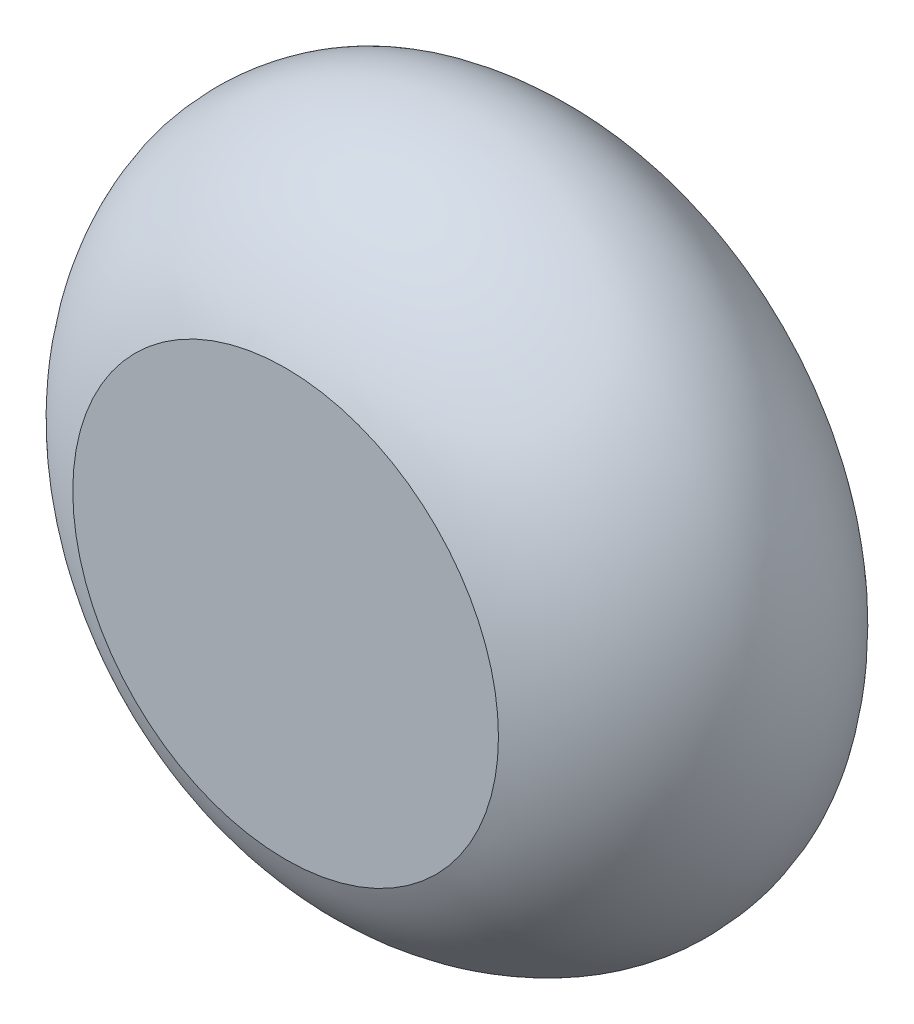
ISO-10303-21;
HEADER;
FILE_DESCRIPTION(('STEP AP214'),'2;1');
FILE_NAME('part.step','',(''),(''),'','','');
FILE_SCHEMA(('AUTOMOTIVE_DESIGN { 1 0 10303 214 1 1 1 1 }'));
ENDSEC;
DATA;
#1=APPLICATION_CONTEXT('core data for automotive mechanical design processes');
#2=APPLICATION_PROTOCOL_DEFINITION('international standard','automotive_design',2000,#1);
#3=PRODUCT_CONTEXT('',#1,'mechanical');
#4=PRODUCT('Part','Part','',(#3));
#5=PRODUCT_RELATED_PRODUCT_CATEGORY('part','',(#4));
#6=PRODUCT_DEFINITION_FORMATION('','',#4);
#7=PRODUCT_DEFINITION_CONTEXT('part definition',#1,'design');
#8=PRODUCT_DEFINITION('design','',#6,#7);
#9=PRODUCT_DEFINITION_SHAPE('','',#8);
#10=(LENGTH_UNIT() NAMED_UNIT(*) SI_UNIT(.MILLI.,.METRE.));
#11=(NAMED_UNIT(*) PLANE_ANGLE_UNIT() SI_UNIT($,.RADIAN.));
#12=(NAMED_UNIT(*) SI_UNIT($,.STERADIAN.) SOLID_ANGLE_UNIT());
#13=UNCERTAINTY_MEASURE_WITH_UNIT(LENGTH_MEASURE(1.E-05),#10,'distance_accuracy_value','');
#14=(GEOMETRIC_REPRESENTATION_CONTEXT(3) GLOBAL_UNCERTAINTY_ASSIGNED_CONTEXT((#13)) GLOBAL_UNIT_ASSIGNED_CONTEXT((#10,
#11,#12)) REPRESENTATION_CONTEXT('',''));
#15=CARTESIAN_POINT('',(0.,0.,0.));
#16=DIRECTION('',(0.,0.,1.));
#17=DIRECTION('',(1.,0.,0.));
#18=AXIS2_PLACEMENT_3D('',#15,#16,#17);
#19=CARTESIAN_POINT('',(-31.7507270258272,0.,11.5242548426674));
#20=DIRECTION('',(0.,0.,1.));
#21=DIRECTION('',(1.,0.,0.));
#22=AXIS2_PLACEMENT_3D('',#19,#20,#21);
#23=PLANE('',#22);
#24=CARTESIAN_POINT('',(1.77597284837264,0.,11.5242548426674));
#25=DIRECTION('',(0.,0.,-1.));
#26=DIRECTION('',(-1.,0.,0.));
#27=AXIS2_PLACEMENT_3D('',#24,#25,#26);
#28=CIRCLE('',#27,33.5266998741998);
#29=CARTESIAN_POINT('',(-31.7507270258272,0.,11.5242548426674));
#30=VERTEX_POINT('',#29);
#31=EDGE_CURVE('E10',#30,#30,#28,.T.);
#32=ORIENTED_EDGE('',*,*,#31,.F.);
#33=EDGE_LOOP('',(#32));
#34=FACE_BOUND('',#33,.T.);
#35=ADVANCED_FACE('F33',(#34),#23,.T.);
#36=CARTESIAN_POINT('',(-23.4912765376681,0.,-42.3911084493321));
#37=CARTESIAN_POINT('',(-24.1666855219635,0.,-42.2764467333667));
#38=CARTESIAN_POINT('',(-25.4965723151258,0.,-42.0431811106222));
#39=CARTESIAN_POINT('',(-28.3038036756089,0.,-41.4929146497506));
#40=CARTESIAN_POINT('',(-31.9330255117929,0.,-40.6183541533968));
#41=CARTESIAN_POINT('',(-35.6546455542463,0.,-39.3364034703208));
#42=CARTESIAN_POINT('',(-38.612268310742,0.,-37.9577572193897));
#43=CARTESIAN_POINT('',(-40.7949003928778,0.,-36.7189004219426));
#44=CARTESIAN_POINT('',(-42.9206477700658,0.,-35.244368575597));
#45=CARTESIAN_POINT('',(-44.919833860405,0.,-33.5259350081428));
#46=CARTESIAN_POINT('',(-46.6477697954922,0.,-31.7467443163266));
#47=CARTESIAN_POINT('',(-48.1477137516577,0.,-30.0024465083571));
#48=CARTESIAN_POINT('',(-49.6804249176507,0.,-27.9104500531556));
#49=CARTESIAN_POINT('',(-51.0655369181551,0.,-25.4388141138087));
#50=CARTESIAN_POINT('',(-52.1381083716501,0.,-22.5104903079222));
#51=CARTESIAN_POINT('',(-52.7280216998819,0.,-19.5401051202183));
#52=CARTESIAN_POINT('',(-52.9528334928057,0.,-16.5704867578004));
#53=CARTESIAN_POINT('',(-52.8092037202841,0.,-13.600510598197));
#54=CARTESIAN_POINT('',(-52.297850633503,0.,-10.8289946653927));
#55=CARTESIAN_POINT('',(-51.5148769575268,0.,-8.31246371989087));
#56=CARTESIAN_POINT('',(-50.585354354876,0.,-6.08441356163141));
#57=CARTESIAN_POINT('',(-49.1678871767397,0.,-3.24452201028858));
#58=CARTESIAN_POINT('',(-46.9744544411255,0.,0.183259963619099));
#59=CARTESIAN_POINT('',(-43.74696303617,0.,3.90490075542665));
#60=CARTESIAN_POINT('',(-40.6312389935372,0.,6.5868861327688));
#61=CARTESIAN_POINT('',(-37.9472980526357,0.,8.43193414568931));
#62=CARTESIAN_POINT('',(-36.2028378214822,0.,9.45465790072389));
#63=CARTESIAN_POINT('',(-34.7807753925396,0.,10.1899342553314));
#64=CARTESIAN_POINT('',(-33.8729037347869,0.,10.6186548170408));
#65=CARTESIAN_POINT('',(-33.2496710231231,0.,10.8938690639367));
#66=CARTESIAN_POINT('',(-32.8659632068811,0.,11.0566124490025));
#67=CARTESIAN_POINT('',(-32.4380777994266,0.,11.2355383768773));
#68=CARTESIAN_POINT('',(-32.0507480708602,0.,11.3983781640553));
#69=CARTESIAN_POINT('',(-31.7507270258272,0.,11.5242548426674));
#70=B_SPLINE_CURVE_WITH_KNOTS('',3,(#36,#37,#38,#39,#40,#41,#42,#43,#44,#45,#46,#47,#48,#49,#50,
#51,#52,#53,#54,#55,#56,#57,#58,#59,#60,#61,#62,#63,#64,#65,#66,#67,#68,#69),.UNSPECIFIED.,.F.,
.F.,(4,1,1,1,1,1,1,1,1,1,1,1,1,1,1,1,1,1,1,1,1,1,1,1,1,1,1,1,1,1,1,4),(0.,0.0318660551666886,
0.0637321103333772,0.127464220666754,0.191196331000132,0.22306238616682,0.254928441333509,
0.286794496500197,0.318660551666886,0.350526606833575,0.382392662000263,0.414258717166952,
0.44612477233364,0.477990827500329,0.509856882667018,0.541722937833706,0.573588993000395,
0.605455048167083,0.637321103333772,0.669187158500461,0.701053213667149,0.764785324000526,
0.828517434333903,0.892249544667281,0.924115599833969,0.955981655000658,0.971914682584002,
0.987847710167347,0.995814223959019,0.999797480854855,1.00378073775069,1.01971376533404),.UNSPECIFIED.);
#71=CARTESIAN_POINT('',(1.77597284837264,0.,6.52425484266742));
#72=DIRECTION('',(0.,0.,-1.));
#73=AXIS1_PLACEMENT('',#71,#72);
#74=SURFACE_OF_REVOLUTION('',#70,#73);
#75=ORIENTED_EDGE('',*,*,#31,.T.);
#76=EDGE_LOOP('',(#75));
#77=FACE_BOUND('',#76,.T.);
#78=CARTESIAN_POINT('',(1.77597284837264,0.,-42.3911084493321));
#79=DIRECTION('',(0.,0.,-1.));
#80=DIRECTION('',(-1.,0.,0.));
#81=AXIS2_PLACEMENT_3D('',#78,#79,#80);
#82=CIRCLE('',#81,25.2672493860407);
#83=CARTESIAN_POINT('',(-23.4912765376681,0.,-42.3911084493321));
#84=VERTEX_POINT('',#83);
#85=EDGE_CURVE('E39',#84,#84,#82,.T.);
#86=ORIENTED_EDGE('',*,*,#85,.F.);
#87=EDGE_LOOP('',(#86));
#88=FACE_BOUND('',#87,.T.);
#89=ADVANCED_FACE('F65',(#77,#88),#74,.F.);
#90=CARTESIAN_POINT('',(1.77597284837264,0.,-25.0896585981768));
#91=DIRECTION('',(0.,0.,-1.));
#92=DIRECTION('',(-1.,0.,0.));
#93=AXIS2_PLACEMENT_3D('',#90,#91,#92);
#94=TOROIDAL_SURFACE('',#93,22.295352763492,17.5548379795188);
#95=ORIENTED_EDGE('',*,*,#85,.T.);
#96=EDGE_LOOP('',(#95));
#97=FACE_BOUND('',#96,.T.);
#98=CARTESIAN_POINT('',(1.77597284837264,0.,-42.5338731990823));
#99=DIRECTION('',(0.,0.,-1.));
#100=DIRECTION('',(-1.,0.,0.));
#101=AXIS2_PLACEMENT_3D('',#98,#99,#100);
#102=CIRCLE('',#101,24.2630197690377);
#103=CARTESIAN_POINT('',(-22.487046920665,0.,-42.5338731990823));
#104=VERTEX_POINT('',#103);
#105=EDGE_CURVE('E43',#104,#104,#102,.T.);
#106=ORIENTED_EDGE('',*,*,#105,.F.);
#107=EDGE_LOOP('',(#106));
#108=FACE_BOUND('',#107,.T.);
#109=ADVANCED_FACE('F68',(#97,#108),#94,.T.);
#110=CARTESIAN_POINT('',(1.77597284837264,0.,-37.4616390393326));
#111=DIRECTION('',(0.,0.,1.));
#112=DIRECTION('',(1.,0.,0.));
#113=AXIS2_PLACEMENT_3D('',#110,#111,#112);
#114=CONICAL_SURFACE('',#113,24.4303913718715,0.032985641066542);
#115=ORIENTED_EDGE('',*,*,#105,.T.);
#116=EDGE_LOOP('',(#115));
#117=FACE_BOUND('',#116,.T.);
#118=CARTESIAN_POINT('',(1.77597284837264,0.,-37.4616390393326));
#119=DIRECTION('',(0.,0.,-1.));
#120=DIRECTION('',(-1.,0.,0.));
#121=AXIS2_PLACEMENT_3D('',#118,#119,#120);
#122=CIRCLE('',#121,24.4303913718715);
#123=CARTESIAN_POINT('',(-22.6544185234989,0.,-37.4616390393326));
#124=VERTEX_POINT('',#123);
#125=EDGE_CURVE('E47',#124,#124,#122,.T.);
#126=ORIENTED_EDGE('',*,*,#125,.F.);
#127=EDGE_LOOP('',(#126));
#128=FACE_BOUND('',#127,.T.);
#129=ADVANCED_FACE('F71',(#117,#128),#114,.F.);
#130=CARTESIAN_POINT('',(-30.7443233031283,0.,6.52425484266742));
#131=CARTESIAN_POINT('',(-31.3566202165093,0.,6.26735985794282));
#132=CARTESIAN_POINT('',(-32.5630664499164,0.,5.7284497767297));
#133=CARTESIAN_POINT('',(-34.9434163719061,0.,4.44402778368702));
#134=CARTESIAN_POINT('',(-37.7679359462478,0.,2.51542636215574));
#135=CARTESIAN_POINT('',(-40.8176509049681,0.,-0.284125878193903));
#136=CARTESIAN_POINT('',(-43.4305030680287,0.,-3.47750808097624));
#137=CARTESIAN_POINT('',(-45.5267040426169,0.,-6.97344043356022));
#138=CARTESIAN_POINT('',(-47.1176673941058,0.,-10.6042593116971));
#139=CARTESIAN_POINT('',(-48.0322370415421,0.,-14.7525436297429));
#140=CARTESIAN_POINT('',(-47.8460117240651,0.,-18.7245600990275));
#141=CARTESIAN_POINT('',(-47.1329575063071,0.,-21.7298479854861));
#142=CARTESIAN_POINT('',(-46.0127500874267,0.,-24.4443339156794));
#143=CARTESIAN_POINT('',(-44.4406226866437,0.,-26.6637271319139));
#144=CARTESIAN_POINT('',(-42.6960572253812,0.,-28.6534141978722));
#145=CARTESIAN_POINT('',(-41.2250691656256,0.,-30.1243389309125));
#146=CARTESIAN_POINT('',(-39.6153206000132,0.,-31.4636376744399));
#147=CARTESIAN_POINT('',(-36.194958579552,0.,-33.772704977919));
#148=CARTESIAN_POINT('',(-31.7350420853664,0.,-35.5248500547159));
#149=CARTESIAN_POINT('',(-27.1596919817886,0.,-36.6225970028718));
#150=CARTESIAN_POINT('',(-24.5620089775842,0.,-37.1306980307219));
#151=CARTESIAN_POINT('',(-23.2935864567917,0.,-37.3531298342058));
#152=CARTESIAN_POINT('',(-22.6544185234989,0.,-37.4616390393326));
#153=B_SPLINE_CURVE_WITH_KNOTS('',3,(#130,#131,#132,#133,#134,#135,#136,#137,#138,#139,#140,
#141,#142,#143,#144,#145,#146,#147,#148,#149,#150,#151,#152),.UNSPECIFIED.,.F.,.F.,(4,1,1,1,1,1,
1,1,1,1,1,1,1,1,1,1,1,1,1,1,4),(0.,0.0313526758611148,0.0627053517222296,0.125410703444459,
0.188116055166689,0.250821406888918,0.313526758611148,0.376232110333377,0.438937462055607,
0.501642813777837,0.532995489638951,0.564348165500066,0.627053517222296,0.658406193083411,
0.689758868944525,0.72111154480564,0.752464220666755,0.877874924111214,0.940580275833444,
0.971932951694559,1.00328562755567),.UNSPECIFIED.);
#154=CARTESIAN_POINT('',(1.77597284837264,0.,6.52425484266742));
#155=DIRECTION('',(0.,0.,-1.));
#156=AXIS1_PLACEMENT('',#154,#155);
#157=SURFACE_OF_REVOLUTION('',#153,#156);
#158=ORIENTED_EDGE('',*,*,#125,.T.);
#159=EDGE_LOOP('',(#158));
#160=FACE_BOUND('',#159,.T.);
#161=CARTESIAN_POINT('',(1.77597284837264,0.,6.52425484266742));
#162=DIRECTION('',(0.,0.,-1.));
#163=DIRECTION('',(-1.,0.,0.));
#164=AXIS2_PLACEMENT_3D('',#161,#162,#163);
#165=CIRCLE('',#164,32.5202961515009);
#166=CARTESIAN_POINT('',(-30.7443233031283,0.,6.52425484266742));
#167=VERTEX_POINT('',#166);
#168=EDGE_CURVE('E52',#167,#167,#165,.T.);
#169=ORIENTED_EDGE('',*,*,#168,.F.);
#170=EDGE_LOOP('',(#169));
#171=FACE_BOUND('',#170,.T.);
#172=ADVANCED_FACE('F74',(#160,#171),#157,.F.);
#173=CARTESIAN_POINT('',(-30.7443233031283,0.,6.52425484266742));
#174=DIRECTION('',(0.,0.,-1.));
#175=DIRECTION('',(-1.,0.,0.));
#176=AXIS2_PLACEMENT_3D('',#173,#174,#175);
#177=PLANE('',#176);
#178=ORIENTED_EDGE('',*,*,#168,.T.);
#179=EDGE_LOOP('',(#178));
#180=FACE_BOUND('',#179,.T.);
#181=ADVANCED_FACE('F78',(#180),#177,.T.);
#182=CLOSED_SHELL('',(#35,#89,#109,#129,#172,#181));
#183=MANIFOLD_SOLID_BREP('B2',#182);
#184=ADVANCED_BREP_SHAPE_REPRESENTATION('',(#18,#183),#14);
#185=SHAPE_DEFINITION_REPRESENTATION(#9,#184);
ENDSEC;
END-ISO-10303-21;
